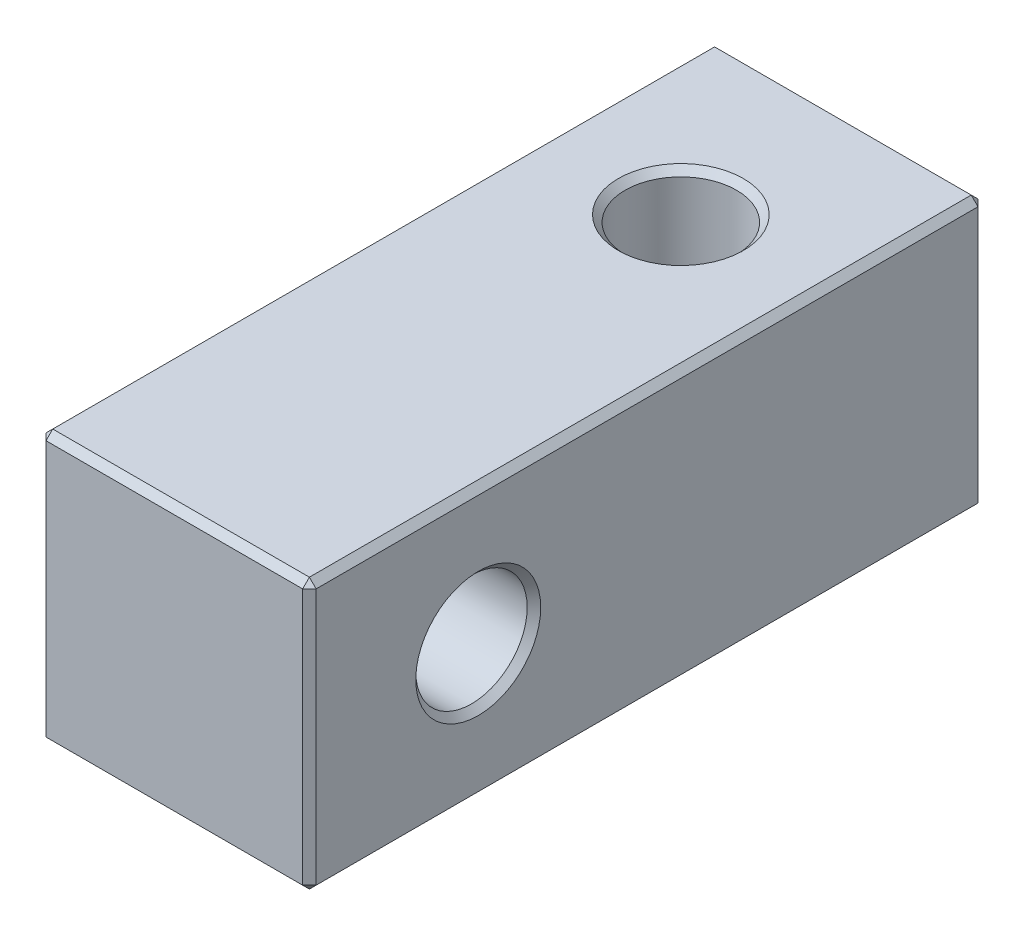
ISO-10303-21;
HEADER;
FILE_DESCRIPTION(('STEP AP214'),'2;1');
FILE_NAME('part.step','',(''),(''),'','','');
FILE_SCHEMA(('AUTOMOTIVE_DESIGN { 1 0 10303 214 1 1 1 1 }'));
ENDSEC;
DATA;
#1=APPLICATION_CONTEXT('core data for automotive mechanical design processes');
#2=APPLICATION_PROTOCOL_DEFINITION('international standard','automotive_design',2000,#1);
#3=PRODUCT_CONTEXT('',#1,'mechanical');
#4=PRODUCT('Part','Part','',(#3));
#5=PRODUCT_RELATED_PRODUCT_CATEGORY('part','',(#4));
#6=PRODUCT_DEFINITION_FORMATION('','',#4);
#7=PRODUCT_DEFINITION_CONTEXT('part definition',#1,'design');
#8=PRODUCT_DEFINITION('design','',#6,#7);
#9=PRODUCT_DEFINITION_SHAPE('','',#8);
#10=(LENGTH_UNIT() NAMED_UNIT(*) SI_UNIT(.MILLI.,.METRE.));
#11=(NAMED_UNIT(*) PLANE_ANGLE_UNIT() SI_UNIT($,.RADIAN.));
#12=(NAMED_UNIT(*) SI_UNIT($,.STERADIAN.) SOLID_ANGLE_UNIT());
#13=UNCERTAINTY_MEASURE_WITH_UNIT(LENGTH_MEASURE(1.E-05),#10,'distance_accuracy_value','');
#14=(GEOMETRIC_REPRESENTATION_CONTEXT(3) GLOBAL_UNCERTAINTY_ASSIGNED_CONTEXT((#13)) GLOBAL_UNIT_ASSIGNED_CONTEXT((#10,
#11,#12)) REPRESENTATION_CONTEXT('',''));
#15=CARTESIAN_POINT('',(0.,0.,0.));
#16=DIRECTION('',(0.,0.,1.));
#17=DIRECTION('',(1.,0.,0.));
#18=AXIS2_PLACEMENT_3D('',#15,#16,#17);
#19=CARTESIAN_POINT('',(4.,4.,10.));
#20=DIRECTION('',(-1.,0.,0.));
#21=DIRECTION('',(0.,-1.,0.));
#22=AXIS2_PLACEMENT_3D('',#19,#20,#21);
#23=PLANE('',#22);
#24=DIRECTION('',(0.,-1.,0.));
#25=VECTOR('',#24,1.);
#26=CARTESIAN_POINT('',(4.,-4.,9.8));
#27=LINE('',#26,#25);
#28=CARTESIAN_POINT('',(4.,3.8,9.8));
#29=VERTEX_POINT('',#28);
#30=CARTESIAN_POINT('',(4.,-3.8,9.8));
#31=VERTEX_POINT('',#30);
#32=EDGE_CURVE('E51',#29,#31,#27,.T.);
#33=ORIENTED_EDGE('',*,*,#32,.T.);
#34=DIRECTION('',(0.,0.,-1.));
#35=VECTOR('',#34,1.);
#36=CARTESIAN_POINT('',(4.,-3.8,10.));
#37=LINE('',#36,#35);
#38=CARTESIAN_POINT('',(4.,-3.8,-9.8));
#39=VERTEX_POINT('',#38);
#40=EDGE_CURVE('E11',#31,#39,#37,.T.);
#41=ORIENTED_EDGE('',*,*,#40,.T.);
#42=DIRECTION('',(0.,1.,0.));
#43=VECTOR('',#42,1.);
#44=CARTESIAN_POINT('',(4.,4.,-9.8));
#45=LINE('',#44,#43);
#46=CARTESIAN_POINT('',(4.,3.8,-9.8));
#47=VERTEX_POINT('',#46);
#48=EDGE_CURVE('E232',#39,#47,#45,.T.);
#49=ORIENTED_EDGE('',*,*,#48,.T.);
#50=DIRECTION('',(0.,0.,1.));
#51=VECTOR('',#50,1.);
#52=CARTESIAN_POINT('',(4.,3.8,10.));
#53=LINE('',#52,#51);
#54=EDGE_CURVE('E62',#47,#29,#53,.T.);
#55=ORIENTED_EDGE('',*,*,#54,.T.);
#56=EDGE_LOOP('',(#33,#41,#49,#55));
#57=FACE_BOUND('',#56,.T.);
#58=CARTESIAN_POINT('',(4.,0.,5.));
#59=DIRECTION('',(-1.,0.,0.));
#60=DIRECTION('',(0.,-1.,0.));
#61=AXIS2_PLACEMENT_3D('',#58,#59,#60);
#62=CIRCLE('',#61,1.85);
#63=CARTESIAN_POINT('',(4.,-1.85,5.));
#64=VERTEX_POINT('',#63);
#65=EDGE_CURVE('E229',#64,#64,#62,.T.);
#66=ORIENTED_EDGE('',*,*,#65,.T.);
#67=EDGE_LOOP('',(#66));
#68=FACE_BOUND('',#67,.T.);
#69=ADVANCED_FACE('F41',(#57,#68),#23,.F.);
#70=CARTESIAN_POINT('',(-4.,4.,10.));
#71=DIRECTION('',(0.,-1.,0.));
#72=DIRECTION('',(0.,0.,-1.));
#73=AXIS2_PLACEMENT_3D('',#70,#71,#72);
#74=PLANE('',#73);
#75=CARTESIAN_POINT('',(0.,4.,-5.));
#76=DIRECTION('',(0.,-1.,0.));
#77=DIRECTION('',(0.,0.,-1.));
#78=AXIS2_PLACEMENT_3D('',#75,#76,#77);
#79=CIRCLE('',#78,1.85);
#80=CARTESIAN_POINT('',(0.,4.,-6.85));
#81=VERTEX_POINT('',#80);
#82=EDGE_CURVE('E210',#81,#81,#79,.T.);
#83=ORIENTED_EDGE('',*,*,#82,.T.);
#84=EDGE_LOOP('',(#83));
#85=FACE_BOUND('',#84,.T.);
#86=DIRECTION('',(0.,0.,1.));
#87=VECTOR('',#86,1.);
#88=CARTESIAN_POINT('',(-3.8,4.,10.));
#89=LINE('',#88,#87);
#90=CARTESIAN_POINT('',(-3.8,4.,-9.8));
#91=VERTEX_POINT('',#90);
#92=CARTESIAN_POINT('',(-3.8,4.,9.8));
#93=VERTEX_POINT('',#92);
#94=EDGE_CURVE('E205',#91,#93,#89,.T.);
#95=ORIENTED_EDGE('',*,*,#94,.T.);
#96=DIRECTION('',(1.,0.,0.));
#97=VECTOR('',#96,1.);
#98=CARTESIAN_POINT('',(4.,4.,9.8));
#99=LINE('',#98,#97);
#100=CARTESIAN_POINT('',(3.8,4.,9.8));
#101=VERTEX_POINT('',#100);
#102=EDGE_CURVE('E207',#93,#101,#99,.T.);
#103=ORIENTED_EDGE('',*,*,#102,.T.);
#104=DIRECTION('',(0.,0.,-1.));
#105=VECTOR('',#104,1.);
#106=CARTESIAN_POINT('',(3.8,4.,10.));
#107=LINE('',#106,#105);
#108=CARTESIAN_POINT('',(3.8,4.,-9.8));
#109=VERTEX_POINT('',#108);
#110=EDGE_CURVE('E201',#101,#109,#107,.T.);
#111=ORIENTED_EDGE('',*,*,#110,.T.);
#112=DIRECTION('',(-1.,0.,0.));
#113=VECTOR('',#112,1.);
#114=CARTESIAN_POINT('',(-4.,4.,-9.8));
#115=LINE('',#114,#113);
#116=EDGE_CURVE('E203',#109,#91,#115,.T.);
#117=ORIENTED_EDGE('',*,*,#116,.T.);
#118=EDGE_LOOP('',(#95,#103,#111,#117));
#119=FACE_BOUND('',#118,.T.);
#120=ADVANCED_FACE('F332',(#85,#119),#74,.F.);
#121=CARTESIAN_POINT('',(-4.,4.,10.));
#122=DIRECTION('',(1.,0.,0.));
#123=DIRECTION('',(0.,1.,0.));
#124=AXIS2_PLACEMENT_3D('',#121,#122,#123);
#125=PLANE('',#124);
#126=CARTESIAN_POINT('',(-4.,0.,5.));
#127=DIRECTION('',(1.,0.,0.));
#128=DIRECTION('',(0.,1.,0.));
#129=AXIS2_PLACEMENT_3D('',#126,#127,#128);
#130=CIRCLE('',#129,1.84999999999999);
#131=CARTESIAN_POINT('',(-4.,1.85,5.));
#132=VERTEX_POINT('',#131);
#133=EDGE_CURVE('E192',#132,#132,#130,.T.);
#134=ORIENTED_EDGE('',*,*,#133,.T.);
#135=EDGE_LOOP('',(#134));
#136=FACE_BOUND('',#135,.T.);
#137=DIRECTION('',(0.,0.,1.));
#138=VECTOR('',#137,1.);
#139=CARTESIAN_POINT('',(-4.,-3.8,10.));
#140=LINE('',#139,#138);
#141=CARTESIAN_POINT('',(-4.,-3.8,-9.8));
#142=VERTEX_POINT('',#141);
#143=CARTESIAN_POINT('',(-4.,-3.8,9.8));
#144=VERTEX_POINT('',#143);
#145=EDGE_CURVE('E187',#142,#144,#140,.T.);
#146=ORIENTED_EDGE('',*,*,#145,.T.);
#147=DIRECTION('',(0.,1.,0.));
#148=VECTOR('',#147,1.);
#149=CARTESIAN_POINT('',(-4.,4.,9.8));
#150=LINE('',#149,#148);
#151=CARTESIAN_POINT('',(-4.,3.8,9.8));
#152=VERTEX_POINT('',#151);
#153=EDGE_CURVE('E189',#144,#152,#150,.T.);
#154=ORIENTED_EDGE('',*,*,#153,.T.);
#155=DIRECTION('',(0.,0.,-1.));
#156=VECTOR('',#155,1.);
#157=CARTESIAN_POINT('',(-4.,3.8,10.));
#158=LINE('',#157,#156);
#159=CARTESIAN_POINT('',(-4.,3.8,-9.8));
#160=VERTEX_POINT('',#159);
#161=EDGE_CURVE('E183',#152,#160,#158,.T.);
#162=ORIENTED_EDGE('',*,*,#161,.T.);
#163=DIRECTION('',(0.,-1.,0.));
#164=VECTOR('',#163,1.);
#165=CARTESIAN_POINT('',(-4.,4.,-9.8));
#166=LINE('',#165,#164);
#167=EDGE_CURVE('E185',#160,#142,#166,.T.);
#168=ORIENTED_EDGE('',*,*,#167,.T.);
#169=EDGE_LOOP('',(#146,#154,#162,#168));
#170=FACE_BOUND('',#169,.T.);
#171=ADVANCED_FACE('F360',(#136,#170),#125,.F.);
#172=CARTESIAN_POINT('',(-4.,-4.,10.));
#173=DIRECTION('',(0.,1.,0.));
#174=DIRECTION('',(0.,0.,1.));
#175=AXIS2_PLACEMENT_3D('',#172,#173,#174);
#176=PLANE('',#175);
#177=CARTESIAN_POINT('',(0.,-4.,-5.));
#178=DIRECTION('',(0.,1.,0.));
#179=DIRECTION('',(0.,0.,1.));
#180=AXIS2_PLACEMENT_3D('',#177,#178,#179);
#181=CIRCLE('',#180,1.84999999999999);
#182=CARTESIAN_POINT('',(0.,-4.,-3.15));
#183=VERTEX_POINT('',#182);
#184=EDGE_CURVE('E174',#183,#183,#181,.T.);
#185=ORIENTED_EDGE('',*,*,#184,.T.);
#186=EDGE_LOOP('',(#185));
#187=FACE_BOUND('',#186,.T.);
#188=DIRECTION('',(-1.,0.,0.));
#189=VECTOR('',#188,1.);
#190=CARTESIAN_POINT('',(-4.,-4.,9.8));
#191=LINE('',#190,#189);
#192=CARTESIAN_POINT('',(3.8,-4.,9.8));
#193=VERTEX_POINT('',#192);
#194=CARTESIAN_POINT('',(-3.8,-4.,9.8));
#195=VERTEX_POINT('',#194);
#196=EDGE_CURVE('E142',#193,#195,#191,.T.);
#197=ORIENTED_EDGE('',*,*,#196,.T.);
#198=DIRECTION('',(0.,0.,-1.));
#199=VECTOR('',#198,1.);
#200=CARTESIAN_POINT('',(-3.8,-4.,10.));
#201=LINE('',#200,#199);
#202=CARTESIAN_POINT('',(-3.8,-4.,-9.8));
#203=VERTEX_POINT('',#202);
#204=EDGE_CURVE('E138',#195,#203,#201,.T.);
#205=ORIENTED_EDGE('',*,*,#204,.T.);
#206=DIRECTION('',(1.,0.,0.));
#207=VECTOR('',#206,1.);
#208=CARTESIAN_POINT('',(-4.,-4.,-9.8));
#209=LINE('',#208,#207);
#210=CARTESIAN_POINT('',(3.8,-4.,-9.8));
#211=VERTEX_POINT('',#210);
#212=EDGE_CURVE('E130',#203,#211,#209,.T.);
#213=ORIENTED_EDGE('',*,*,#212,.T.);
#214=DIRECTION('',(0.,0.,1.));
#215=VECTOR('',#214,1.);
#216=CARTESIAN_POINT('',(3.8,-4.,10.));
#217=LINE('',#216,#215);
#218=EDGE_CURVE('E135',#211,#193,#217,.T.);
#219=ORIENTED_EDGE('',*,*,#218,.T.);
#220=EDGE_LOOP('',(#197,#205,#213,#219));
#221=FACE_BOUND('',#220,.T.);
#222=ADVANCED_FACE('F133',(#187,#221),#176,.F.);
#223=CARTESIAN_POINT('',(0.,0.,10.));
#224=DIRECTION('',(0.,0.,1.));
#225=DIRECTION('',(1.,0.,0.));
#226=AXIS2_PLACEMENT_3D('',#223,#224,#225);
#227=PLANE('',#226);
#228=DIRECTION('',(0.,-1.,0.));
#229=VECTOR('',#228,1.);
#230=CARTESIAN_POINT('',(-3.8,-4.,10.));
#231=LINE('',#230,#229);
#232=CARTESIAN_POINT('',(-3.8,3.8,10.));
#233=VERTEX_POINT('',#232);
#234=CARTESIAN_POINT('',(-3.8,-3.8,10.));
#235=VERTEX_POINT('',#234);
#236=EDGE_CURVE('E217',#233,#235,#231,.T.);
#237=ORIENTED_EDGE('',*,*,#236,.T.);
#238=DIRECTION('',(1.,0.,0.));
#239=VECTOR('',#238,1.);
#240=CARTESIAN_POINT('',(4.,-3.8,10.));
#241=LINE('',#240,#239);
#242=CARTESIAN_POINT('',(3.8,-3.8,10.));
#243=VERTEX_POINT('',#242);
#244=EDGE_CURVE('E219',#235,#243,#241,.T.);
#245=ORIENTED_EDGE('',*,*,#244,.T.);
#246=DIRECTION('',(0.,1.,0.));
#247=VECTOR('',#246,1.);
#248=CARTESIAN_POINT('',(3.8,4.,10.));
#249=LINE('',#248,#247);
#250=CARTESIAN_POINT('',(3.8,3.8,10.));
#251=VERTEX_POINT('',#250);
#252=EDGE_CURVE('E213',#243,#251,#249,.T.);
#253=ORIENTED_EDGE('',*,*,#252,.T.);
#254=DIRECTION('',(-1.,0.,0.));
#255=VECTOR('',#254,1.);
#256=CARTESIAN_POINT('',(-4.,3.8,10.));
#257=LINE('',#256,#255);
#258=EDGE_CURVE('E215',#251,#233,#257,.T.);
#259=ORIENTED_EDGE('',*,*,#258,.T.);
#260=EDGE_LOOP('',(#237,#245,#253,#259));
#261=FACE_BOUND('',#260,.T.);
#262=ADVANCED_FACE('F352',(#261),#227,.T.);
#263=CARTESIAN_POINT('',(0.,0.,-10.));
#264=DIRECTION('',(0.,0.,1.));
#265=DIRECTION('',(1.,0.,0.));
#266=AXIS2_PLACEMENT_3D('',#263,#264,#265);
#267=PLANE('',#266);
#268=DIRECTION('',(0.,-1.,0.));
#269=VECTOR('',#268,1.);
#270=CARTESIAN_POINT('',(3.8,0.,-10.));
#271=LINE('',#270,#269);
#272=CARTESIAN_POINT('',(3.8,3.8,-10.));
#273=VERTEX_POINT('',#272);
#274=CARTESIAN_POINT('',(3.8,-3.8,-10.));
#275=VERTEX_POINT('',#274);
#276=EDGE_CURVE('E222',#273,#275,#271,.T.);
#277=ORIENTED_EDGE('',*,*,#276,.T.);
#278=DIRECTION('',(-1.,0.,0.));
#279=VECTOR('',#278,1.);
#280=CARTESIAN_POINT('',(0.,-3.8,-10.));
#281=LINE('',#280,#279);
#282=CARTESIAN_POINT('',(-3.8,-3.8,-10.));
#283=VERTEX_POINT('',#282);
#284=EDGE_CURVE('E150',#275,#283,#281,.T.);
#285=ORIENTED_EDGE('',*,*,#284,.T.);
#286=DIRECTION('',(0.,1.,0.));
#287=VECTOR('',#286,1.);
#288=CARTESIAN_POINT('',(-3.8,0.,-10.));
#289=LINE('',#288,#287);
#290=CARTESIAN_POINT('',(-3.8,3.8,-10.));
#291=VERTEX_POINT('',#290);
#292=EDGE_CURVE('E226',#283,#291,#289,.T.);
#293=ORIENTED_EDGE('',*,*,#292,.T.);
#294=DIRECTION('',(1.,0.,0.));
#295=VECTOR('',#294,1.);
#296=CARTESIAN_POINT('',(0.,3.8,-10.));
#297=LINE('',#296,#295);
#298=EDGE_CURVE('E224',#291,#273,#297,.T.);
#299=ORIENTED_EDGE('',*,*,#298,.T.);
#300=EDGE_LOOP('',(#277,#285,#293,#299));
#301=FACE_BOUND('',#300,.T.);
#302=ADVANCED_FACE('F327',(#301),#267,.F.);
#303=CARTESIAN_POINT('',(4.,0.,5.));
#304=DIRECTION('',(1.,0.,0.));
#305=DIRECTION('',(0.,0.,-1.));
#306=AXIS2_PLACEMENT_3D('',#303,#304,#305);
#307=CYLINDRICAL_SURFACE('',#306,1.65);
#308=CARTESIAN_POINT('',(-3.8,0.,5.));
#309=DIRECTION('',(1.,0.,0.));
#310=DIRECTION('',(0.,0.,-1.));
#311=AXIS2_PLACEMENT_3D('',#308,#309,#310);
#312=CIRCLE('',#311,1.65);
#313=CARTESIAN_POINT('',(-3.8,0.,3.35));
#314=VERTEX_POINT('',#313);
#315=EDGE_CURVE('E198',#314,#314,#312,.F.);
#316=ORIENTED_EDGE('',*,*,#315,.T.);
#317=EDGE_LOOP('',(#316));
#318=FACE_BOUND('',#317,.T.);
#319=CARTESIAN_POINT('',(3.8,0.,5.));
#320=DIRECTION('',(-1.,0.,0.));
#321=DIRECTION('',(0.,0.,1.));
#322=AXIS2_PLACEMENT_3D('',#319,#320,#321);
#323=CIRCLE('',#322,1.65);
#324=CARTESIAN_POINT('',(3.8,0.,6.65));
#325=VERTEX_POINT('',#324);
#326=EDGE_CURVE('E195',#325,#325,#323,.F.);
#327=ORIENTED_EDGE('',*,*,#326,.T.);
#328=EDGE_LOOP('',(#327));
#329=FACE_BOUND('',#328,.T.);
#330=ADVANCED_FACE('F340',(#318,#329),#307,.F.);
#331=CARTESIAN_POINT('',(0.,4.,-5.));
#332=DIRECTION('',(0.,1.,0.));
#333=DIRECTION('',(0.,0.,1.));
#334=AXIS2_PLACEMENT_3D('',#331,#332,#333);
#335=CYLINDRICAL_SURFACE('',#334,1.65);
#336=CARTESIAN_POINT('',(0.,-3.8,-5.));
#337=DIRECTION('',(0.,1.,0.));
#338=DIRECTION('',(0.,0.,1.));
#339=AXIS2_PLACEMENT_3D('',#336,#337,#338);
#340=CIRCLE('',#339,1.65);
#341=CARTESIAN_POINT('',(0.,-3.8,-3.35));
#342=VERTEX_POINT('',#341);
#343=EDGE_CURVE('E180',#342,#342,#340,.F.);
#344=ORIENTED_EDGE('',*,*,#343,.T.);
#345=EDGE_LOOP('',(#344));
#346=FACE_BOUND('',#345,.T.);
#347=CARTESIAN_POINT('',(0.,3.8,-5.));
#348=DIRECTION('',(0.,-1.,0.));
#349=DIRECTION('',(0.,0.,-1.));
#350=AXIS2_PLACEMENT_3D('',#347,#348,#349);
#351=CIRCLE('',#350,1.65);
#352=CARTESIAN_POINT('',(0.,3.8,-6.65));
#353=VERTEX_POINT('',#352);
#354=EDGE_CURVE('E177',#353,#353,#351,.F.);
#355=ORIENTED_EDGE('',*,*,#354,.T.);
#356=EDGE_LOOP('',(#355));
#357=FACE_BOUND('',#356,.T.);
#358=ADVANCED_FACE('F342',(#346,#357),#335,.F.);
#359=CARTESIAN_POINT('',(0.,-4.,-5.));
#360=DIRECTION('',(0.,-1.,0.));
#361=DIRECTION('',(0.,0.,-1.));
#362=AXIS2_PLACEMENT_3D('',#359,#360,#361);
#363=CONICAL_SURFACE('',#362,1.85,0.785398163397447);
#364=ORIENTED_EDGE('',*,*,#343,.F.);
#365=EDGE_LOOP('',(#364));
#366=FACE_BOUND('',#365,.T.);
#367=ORIENTED_EDGE('',*,*,#184,.F.);
#368=EDGE_LOOP('',(#367));
#369=FACE_BOUND('',#368,.T.);
#370=ADVANCED_FACE('F349',(#366,#369),#363,.F.);
#371=CARTESIAN_POINT('',(-4.,0.,5.));
#372=DIRECTION('',(-1.,0.,0.));
#373=DIRECTION('',(0.,0.,1.));
#374=AXIS2_PLACEMENT_3D('',#371,#372,#373);
#375=CONICAL_SURFACE('',#374,1.84999999999999,0.785398163397439);
#376=ORIENTED_EDGE('',*,*,#315,.F.);
#377=EDGE_LOOP('',(#376));
#378=FACE_BOUND('',#377,.T.);
#379=ORIENTED_EDGE('',*,*,#133,.F.);
#380=EDGE_LOOP('',(#379));
#381=FACE_BOUND('',#380,.T.);
#382=ADVANCED_FACE('F374',(#378,#381),#375,.F.);
#383=CARTESIAN_POINT('',(0.,3.8,-5.));
#384=DIRECTION('',(0.,1.,0.));
#385=DIRECTION('',(0.,0.,1.));
#386=AXIS2_PLACEMENT_3D('',#383,#384,#385);
#387=CONICAL_SURFACE('',#386,1.65,0.785398163397443);
#388=ORIENTED_EDGE('',*,*,#82,.F.);
#389=EDGE_LOOP('',(#388));
#390=FACE_BOUND('',#389,.T.);
#391=ORIENTED_EDGE('',*,*,#354,.F.);
#392=EDGE_LOOP('',(#391));
#393=FACE_BOUND('',#392,.T.);
#394=ADVANCED_FACE('F381',(#390,#393),#387,.F.);
#395=CARTESIAN_POINT('',(-4.,4.,-9.8));
#396=DIRECTION('',(0.,-0.707106781186548,0.707106781186548));
#397=DIRECTION('',(-1.,0.,0.));
#398=AXIS2_PLACEMENT_3D('',#395,#396,#397);
#399=PLANE('',#398);
#400=DIRECTION('',(0.,0.707106781186547,0.707106781186547));
#401=VECTOR('',#400,1.);
#402=CARTESIAN_POINT('',(-3.8,3.8,-10.));
#403=LINE('',#402,#401);
#404=EDGE_CURVE('E46',#91,#291,#403,.F.);
#405=ORIENTED_EDGE('',*,*,#404,.F.);
#406=ORIENTED_EDGE('',*,*,#116,.F.);
#407=DIRECTION('',(0.,-0.707106781186547,-0.707106781186547));
#408=VECTOR('',#407,1.);
#409=CARTESIAN_POINT('',(3.8,3.8,-10.));
#410=LINE('',#409,#408);
#411=EDGE_CURVE('E170',#273,#109,#410,.F.);
#412=ORIENTED_EDGE('',*,*,#411,.F.);
#413=ORIENTED_EDGE('',*,*,#298,.F.);
#414=EDGE_LOOP('',(#405,#406,#412,#413));
#415=FACE_BOUND('',#414,.T.);
#416=ADVANCED_FACE('F388',(#415),#399,.F.);
#417=CARTESIAN_POINT('',(-3.8,3.8,-10.));
#418=DIRECTION('',(-0.577350269189626,0.577350269189626,-0.577350269189626));
#419=DIRECTION('',(-0.707106781186548,0.,0.707106781186548));
#420=AXIS2_PLACEMENT_3D('',#417,#418,#419);
#421=PLANE('',#420);
#422=DIRECTION('',(-0.707106781186547,-0.707106781186547,0.));
#423=VECTOR('',#422,1.);
#424=CARTESIAN_POINT('',(-3.9,3.9,-9.8));
#425=LINE('',#424,#423);
#426=EDGE_CURVE('E277',#91,#160,#425,.T.);
#427=ORIENTED_EDGE('',*,*,#426,.F.);
#428=ORIENTED_EDGE('',*,*,#404,.T.);
#429=DIRECTION('',(0.707106781186548,0.,-0.707106781186548));
#430=VECTOR('',#429,1.);
#431=CARTESIAN_POINT('',(-3.8,3.8,-10.));
#432=LINE('',#431,#430);
#433=EDGE_CURVE('E280',#160,#291,#432,.T.);
#434=ORIENTED_EDGE('',*,*,#433,.F.);
#435=EDGE_LOOP('',(#427,#428,#434));
#436=FACE_BOUND('',#435,.T.);
#437=ADVANCED_FACE('F489',(#436),#421,.T.);
#438=CARTESIAN_POINT('',(3.8,3.8,-10.));
#439=DIRECTION('',(0.577350269189626,0.577350269189626,-0.577350269189626));
#440=DIRECTION('',(-0.707106781186548,0.,-0.707106781186548));
#441=AXIS2_PLACEMENT_3D('',#438,#439,#440);
#442=PLANE('',#441);
#443=DIRECTION('',(0.707106781186548,0.,0.707106781186548));
#444=VECTOR('',#443,1.);
#445=CARTESIAN_POINT('',(3.8,3.8,-10.));
#446=LINE('',#445,#444);
#447=EDGE_CURVE('E271',#273,#47,#446,.T.);
#448=ORIENTED_EDGE('',*,*,#447,.F.);
#449=ORIENTED_EDGE('',*,*,#411,.T.);
#450=DIRECTION('',(-0.707106781186547,0.707106781186547,0.));
#451=VECTOR('',#450,1.);
#452=CARTESIAN_POINT('',(3.9,3.9,-9.8));
#453=LINE('',#452,#451);
#454=EDGE_CURVE('E274',#47,#109,#453,.T.);
#455=ORIENTED_EDGE('',*,*,#454,.F.);
#456=EDGE_LOOP('',(#448,#449,#455));
#457=FACE_BOUND('',#456,.T.);
#458=ADVANCED_FACE('F287',(#457),#442,.T.);
#459=CARTESIAN_POINT('',(-4.,4.,-9.8));
#460=DIRECTION('',(0.707106781186548,0.,0.707106781186548));
#461=DIRECTION('',(0.,-1.,0.));
#462=AXIS2_PLACEMENT_3D('',#459,#460,#461);
#463=PLANE('',#462);
#464=ORIENTED_EDGE('',*,*,#433,.T.);
#465=ORIENTED_EDGE('',*,*,#292,.F.);
#466=DIRECTION('',(-0.707106781186547,0.,0.707106781186547));
#467=VECTOR('',#466,1.);
#468=CARTESIAN_POINT('',(-3.8,-3.8,-10.));
#469=LINE('',#468,#467);
#470=EDGE_CURVE('E267',#142,#283,#469,.F.);
#471=ORIENTED_EDGE('',*,*,#470,.F.);
#472=ORIENTED_EDGE('',*,*,#167,.F.);
#473=EDGE_LOOP('',(#464,#465,#471,#472));
#474=FACE_BOUND('',#473,.T.);
#475=ADVANCED_FACE('F323',(#474),#463,.F.);
#476=CARTESIAN_POINT('',(-4.,3.8,10.));
#477=DIRECTION('',(0.707106781186548,-0.707106781186548,0.));
#478=DIRECTION('',(0.,0.,-1.));
#479=AXIS2_PLACEMENT_3D('',#476,#477,#478);
#480=PLANE('',#479);
#481=ORIENTED_EDGE('',*,*,#426,.T.);
#482=ORIENTED_EDGE('',*,*,#161,.F.);
#483=DIRECTION('',(0.707106781186547,0.707106781186547,0.));
#484=VECTOR('',#483,1.);
#485=CARTESIAN_POINT('',(-4.,3.8,9.8));
#486=LINE('',#485,#484);
#487=EDGE_CURVE('E264',#93,#152,#486,.F.);
#488=ORIENTED_EDGE('',*,*,#487,.F.);
#489=ORIENTED_EDGE('',*,*,#94,.F.);
#490=EDGE_LOOP('',(#481,#482,#488,#489));
#491=FACE_BOUND('',#490,.T.);
#492=ADVANCED_FACE('F471',(#491),#480,.F.);
#493=CARTESIAN_POINT('',(0.,3.8,10.));
#494=DIRECTION('',(0.,0.707106781186548,0.707106781186548));
#495=DIRECTION('',(1.,0.,0.));
#496=AXIS2_PLACEMENT_3D('',#493,#494,#495);
#497=PLANE('',#496);
#498=DIRECTION('',(0.,-0.707106781186547,0.707106781186547));
#499=VECTOR('',#498,1.);
#500=CARTESIAN_POINT('',(3.8,4.,9.8));
#501=LINE('',#500,#499);
#502=EDGE_CURVE('E258',#101,#251,#501,.T.);
#503=ORIENTED_EDGE('',*,*,#502,.F.);
#504=ORIENTED_EDGE('',*,*,#102,.F.);
#505=DIRECTION('',(0.,0.707106781186547,-0.707106781186547));
#506=VECTOR('',#505,1.);
#507=CARTESIAN_POINT('',(-3.8,3.9,9.9));
#508=LINE('',#507,#506);
#509=EDGE_CURVE('E261',#233,#93,#508,.T.);
#510=ORIENTED_EDGE('',*,*,#509,.F.);
#511=ORIENTED_EDGE('',*,*,#258,.F.);
#512=EDGE_LOOP('',(#503,#504,#510,#511));
#513=FACE_BOUND('',#512,.T.);
#514=ADVANCED_FACE('F465',(#513),#497,.T.);
#515=CARTESIAN_POINT('',(3.8,4.,10.));
#516=DIRECTION('',(-0.707106781186548,-0.707106781186548,0.));
#517=DIRECTION('',(0.,0.,-1.));
#518=AXIS2_PLACEMENT_3D('',#515,#516,#517);
#519=PLANE('',#518);
#520=ORIENTED_EDGE('',*,*,#454,.T.);
#521=ORIENTED_EDGE('',*,*,#110,.F.);
#522=DIRECTION('',(0.707106781186547,-0.707106781186547,0.));
#523=VECTOR('',#522,1.);
#524=CARTESIAN_POINT('',(3.8,4.,9.8));
#525=LINE('',#524,#523);
#526=EDGE_CURVE('E256',#29,#101,#525,.F.);
#527=ORIENTED_EDGE('',*,*,#526,.F.);
#528=ORIENTED_EDGE('',*,*,#54,.F.);
#529=EDGE_LOOP('',(#520,#521,#527,#528));
#530=FACE_BOUND('',#529,.T.);
#531=ADVANCED_FACE('F294',(#530),#519,.F.);
#532=CARTESIAN_POINT('',(4.,4.,-9.8));
#533=DIRECTION('',(-0.707106781186548,0.,0.707106781186548));
#534=DIRECTION('',(0.,1.,0.));
#535=AXIS2_PLACEMENT_3D('',#532,#533,#534);
#536=PLANE('',#535);
#537=ORIENTED_EDGE('',*,*,#447,.T.);
#538=ORIENTED_EDGE('',*,*,#48,.F.);
#539=DIRECTION('',(-0.707106781186547,0.,-0.707106781186547));
#540=VECTOR('',#539,1.);
#541=CARTESIAN_POINT('',(3.9,-3.8,-9.9));
#542=LINE('',#541,#540);
#543=EDGE_CURVE('E154',#275,#39,#542,.F.);
#544=ORIENTED_EDGE('',*,*,#543,.F.);
#545=ORIENTED_EDGE('',*,*,#276,.F.);
#546=EDGE_LOOP('',(#537,#538,#544,#545));
#547=FACE_BOUND('',#546,.T.);
#548=ADVANCED_FACE('F329',(#547),#536,.F.);
#549=CARTESIAN_POINT('',(-4.,-4.,-9.8));
#550=DIRECTION('',(0.,0.707106781186548,0.707106781186548));
#551=DIRECTION('',(1.,0.,0.));
#552=AXIS2_PLACEMENT_3D('',#549,#550,#551);
#553=PLANE('',#552);
#554=DIRECTION('',(0.,0.707106781186547,-0.707106781186547));
#555=VECTOR('',#554,1.);
#556=CARTESIAN_POINT('',(-3.8,-3.8,-10.));
#557=LINE('',#556,#555);
#558=EDGE_CURVE('E269',#283,#203,#557,.F.);
#559=ORIENTED_EDGE('',*,*,#558,.F.);
#560=ORIENTED_EDGE('',*,*,#284,.F.);
#561=DIRECTION('',(0.,-0.707106781186547,0.707106781186547));
#562=VECTOR('',#561,1.);
#563=CARTESIAN_POINT('',(3.8,-4.,-9.8));
#564=LINE('',#563,#562);
#565=EDGE_CURVE('E146',#211,#275,#564,.F.);
#566=ORIENTED_EDGE('',*,*,#565,.F.);
#567=ORIENTED_EDGE('',*,*,#212,.F.);
#568=EDGE_LOOP('',(#559,#560,#566,#567));
#569=FACE_BOUND('',#568,.T.);
#570=ADVANCED_FACE('F148',(#569),#553,.F.);
#571=CARTESIAN_POINT('',(-3.8,-3.8,-10.));
#572=DIRECTION('',(-0.577350269189626,-0.577350269189626,-0.577350269189626));
#573=DIRECTION('',(-0.707106781186548,0.,0.707106781186548));
#574=AXIS2_PLACEMENT_3D('',#571,#572,#573);
#575=PLANE('',#574);
#576=ORIENTED_EDGE('',*,*,#470,.T.);
#577=ORIENTED_EDGE('',*,*,#558,.T.);
#578=DIRECTION('',(0.707106781186547,-0.707106781186547,0.));
#579=VECTOR('',#578,1.);
#580=CARTESIAN_POINT('',(-3.9,-3.9,-9.8));
#581=LINE('',#580,#579);
#582=EDGE_CURVE('E155',#142,#203,#581,.T.);
#583=ORIENTED_EDGE('',*,*,#582,.F.);
#584=EDGE_LOOP('',(#576,#577,#583));
#585=FACE_BOUND('',#584,.T.);
#586=ADVANCED_FACE('F319',(#585),#575,.T.);
#587=CARTESIAN_POINT('',(-4.,3.8,9.8));
#588=DIRECTION('',(-0.577350269189626,0.577350269189626,0.577350269189626));
#589=DIRECTION('',(0.707106781186548,0.,0.707106781186548));
#590=AXIS2_PLACEMENT_3D('',#587,#588,#589);
#591=PLANE('',#590);
#592=ORIENTED_EDGE('',*,*,#509,.T.);
#593=ORIENTED_EDGE('',*,*,#487,.T.);
#594=DIRECTION('',(0.707106781186548,0.,0.707106781186548));
#595=VECTOR('',#594,1.);
#596=CARTESIAN_POINT('',(-4.,3.8,9.8));
#597=LINE('',#596,#595);
#598=EDGE_CURVE('E251',#233,#152,#597,.F.);
#599=ORIENTED_EDGE('',*,*,#598,.F.);
#600=EDGE_LOOP('',(#592,#593,#599));
#601=FACE_BOUND('',#600,.T.);
#602=ADVANCED_FACE('F438',(#601),#591,.T.);
#603=CARTESIAN_POINT('',(3.8,4.,9.8));
#604=DIRECTION('',(0.577350269189626,0.577350269189626,0.577350269189626));
#605=DIRECTION('',(0.707106781186548,0.,-0.707106781186548));
#606=AXIS2_PLACEMENT_3D('',#603,#604,#605);
#607=PLANE('',#606);
#608=ORIENTED_EDGE('',*,*,#526,.T.);
#609=ORIENTED_EDGE('',*,*,#502,.T.);
#610=DIRECTION('',(0.707106781186548,0.,-0.707106781186548));
#611=VECTOR('',#610,1.);
#612=CARTESIAN_POINT('',(3.9,3.8,9.9));
#613=LINE('',#612,#611);
#614=EDGE_CURVE('E161',#29,#251,#613,.F.);
#615=ORIENTED_EDGE('',*,*,#614,.F.);
#616=EDGE_LOOP('',(#608,#609,#615));
#617=FACE_BOUND('',#616,.T.);
#618=ADVANCED_FACE('F298',(#617),#607,.T.);
#619=CARTESIAN_POINT('',(3.8,-4.,-9.8));
#620=DIRECTION('',(0.577350269189626,-0.577350269189626,-0.577350269189626));
#621=DIRECTION('',(-0.707106781186548,0.,-0.707106781186548));
#622=AXIS2_PLACEMENT_3D('',#619,#620,#621);
#623=PLANE('',#622);
#624=ORIENTED_EDGE('',*,*,#565,.T.);
#625=ORIENTED_EDGE('',*,*,#543,.T.);
#626=DIRECTION('',(0.707106781186547,0.707106781186547,0.));
#627=VECTOR('',#626,1.);
#628=CARTESIAN_POINT('',(3.8,-4.,-9.8));
#629=LINE('',#628,#627);
#630=EDGE_CURVE('E157',#211,#39,#629,.T.);
#631=ORIENTED_EDGE('',*,*,#630,.F.);
#632=EDGE_LOOP('',(#624,#625,#631));
#633=FACE_BOUND('',#632,.T.);
#634=ADVANCED_FACE('F158',(#633),#623,.T.);
#635=CARTESIAN_POINT('',(-3.8,-4.,10.));
#636=DIRECTION('',(0.707106781186548,0.707106781186548,0.));
#637=DIRECTION('',(0.,0.,-1.));
#638=AXIS2_PLACEMENT_3D('',#635,#636,#637);
#639=PLANE('',#638);
#640=ORIENTED_EDGE('',*,*,#582,.T.);
#641=ORIENTED_EDGE('',*,*,#204,.F.);
#642=DIRECTION('',(-0.707106781186547,0.707106781186547,0.));
#643=VECTOR('',#642,1.);
#644=CARTESIAN_POINT('',(-3.8,-4.,9.8));
#645=LINE('',#644,#643);
#646=EDGE_CURVE('E162',#144,#195,#645,.F.);
#647=ORIENTED_EDGE('',*,*,#646,.F.);
#648=ORIENTED_EDGE('',*,*,#145,.F.);
#649=EDGE_LOOP('',(#640,#641,#647,#648));
#650=FACE_BOUND('',#649,.T.);
#651=ADVANCED_FACE('F316',(#650),#639,.F.);
#652=CARTESIAN_POINT('',(-3.8,0.,10.));
#653=DIRECTION('',(-0.707106781186548,0.,0.707106781186548));
#654=DIRECTION('',(0.,1.,0.));
#655=AXIS2_PLACEMENT_3D('',#652,#653,#654);
#656=PLANE('',#655);
#657=ORIENTED_EDGE('',*,*,#598,.T.);
#658=ORIENTED_EDGE('',*,*,#153,.F.);
#659=DIRECTION('',(-0.707106781186547,0.,-0.707106781186547));
#660=VECTOR('',#659,1.);
#661=CARTESIAN_POINT('',(-3.9,-3.8,9.9));
#662=LINE('',#661,#660);
#663=EDGE_CURVE('E244',#235,#144,#662,.T.);
#664=ORIENTED_EDGE('',*,*,#663,.F.);
#665=ORIENTED_EDGE('',*,*,#236,.F.);
#666=EDGE_LOOP('',(#657,#658,#664,#665));
#667=FACE_BOUND('',#666,.T.);
#668=ADVANCED_FACE('F416',(#667),#656,.T.);
#669=CARTESIAN_POINT('',(3.8,0.,10.));
#670=DIRECTION('',(0.707106781186548,0.,0.707106781186548));
#671=DIRECTION('',(0.,-1.,0.));
#672=AXIS2_PLACEMENT_3D('',#669,#670,#671);
#673=PLANE('',#672);
#674=ORIENTED_EDGE('',*,*,#614,.T.);
#675=ORIENTED_EDGE('',*,*,#252,.F.);
#676=DIRECTION('',(-0.707106781186547,0.,0.707106781186547));
#677=VECTOR('',#676,1.);
#678=CARTESIAN_POINT('',(3.8,-3.8,10.));
#679=LINE('',#678,#677);
#680=EDGE_CURVE('E241',#31,#243,#679,.T.);
#681=ORIENTED_EDGE('',*,*,#680,.F.);
#682=ORIENTED_EDGE('',*,*,#32,.F.);
#683=EDGE_LOOP('',(#674,#675,#681,#682));
#684=FACE_BOUND('',#683,.T.);
#685=ADVANCED_FACE('F302',(#684),#673,.T.);
#686=CARTESIAN_POINT('',(4.,-3.8,10.));
#687=DIRECTION('',(-0.707106781186548,0.707106781186548,0.));
#688=DIRECTION('',(0.,0.,-1.));
#689=AXIS2_PLACEMENT_3D('',#686,#687,#688);
#690=PLANE('',#689);
#691=ORIENTED_EDGE('',*,*,#630,.T.);
#692=ORIENTED_EDGE('',*,*,#40,.F.);
#693=DIRECTION('',(-0.707106781186547,-0.707106781186547,0.));
#694=VECTOR('',#693,1.);
#695=CARTESIAN_POINT('',(3.9,-3.9,9.8));
#696=LINE('',#695,#694);
#697=EDGE_CURVE('E166',#193,#31,#696,.F.);
#698=ORIENTED_EDGE('',*,*,#697,.F.);
#699=ORIENTED_EDGE('',*,*,#218,.F.);
#700=EDGE_LOOP('',(#691,#692,#698,#699));
#701=FACE_BOUND('',#700,.T.);
#702=ADVANCED_FACE('F164',(#701),#690,.F.);
#703=CARTESIAN_POINT('',(-3.8,-4.,9.8));
#704=DIRECTION('',(-0.577350269189626,-0.577350269189626,0.577350269189626));
#705=DIRECTION('',(0.707106781186548,0.,0.707106781186548));
#706=AXIS2_PLACEMENT_3D('',#703,#704,#705);
#707=PLANE('',#706);
#708=ORIENTED_EDGE('',*,*,#663,.T.);
#709=ORIENTED_EDGE('',*,*,#646,.T.);
#710=DIRECTION('',(0.,0.707106781186547,0.707106781186547));
#711=VECTOR('',#710,1.);
#712=CARTESIAN_POINT('',(-3.8,-4.,9.8));
#713=LINE('',#712,#711);
#714=EDGE_CURVE('E238',#235,#195,#713,.F.);
#715=ORIENTED_EDGE('',*,*,#714,.F.);
#716=EDGE_LOOP('',(#708,#709,#715));
#717=FACE_BOUND('',#716,.T.);
#718=ADVANCED_FACE('F312',(#717),#707,.T.);
#719=CARTESIAN_POINT('',(3.8,-3.8,10.));
#720=DIRECTION('',(0.577350269189626,-0.577350269189626,0.577350269189626));
#721=DIRECTION('',(0.707106781186548,0.,-0.707106781186548));
#722=AXIS2_PLACEMENT_3D('',#719,#720,#721);
#723=PLANE('',#722);
#724=ORIENTED_EDGE('',*,*,#697,.T.);
#725=ORIENTED_EDGE('',*,*,#680,.T.);
#726=DIRECTION('',(0.,-0.707106781186547,-0.707106781186547));
#727=VECTOR('',#726,1.);
#728=CARTESIAN_POINT('',(3.8,-3.8,10.));
#729=LINE('',#728,#727);
#730=EDGE_CURVE('E236',#193,#243,#729,.F.);
#731=ORIENTED_EDGE('',*,*,#730,.F.);
#732=EDGE_LOOP('',(#724,#725,#731));
#733=FACE_BOUND('',#732,.T.);
#734=ADVANCED_FACE('F305',(#733),#723,.T.);
#735=CARTESIAN_POINT('',(0.,-3.8,10.));
#736=DIRECTION('',(0.,-0.707106781186548,0.707106781186548));
#737=DIRECTION('',(-1.,0.,0.));
#738=AXIS2_PLACEMENT_3D('',#735,#736,#737);
#739=PLANE('',#738);
#740=ORIENTED_EDGE('',*,*,#714,.T.);
#741=ORIENTED_EDGE('',*,*,#196,.F.);
#742=ORIENTED_EDGE('',*,*,#730,.T.);
#743=ORIENTED_EDGE('',*,*,#244,.F.);
#744=EDGE_LOOP('',(#740,#741,#742,#743));
#745=FACE_BOUND('',#744,.T.);
#746=ADVANCED_FACE('F308',(#745),#739,.T.);
#747=CARTESIAN_POINT('',(3.8,0.,5.));
#748=DIRECTION('',(1.,0.,0.));
#749=DIRECTION('',(0.,0.,-1.));
#750=AXIS2_PLACEMENT_3D('',#747,#748,#749);
#751=CONICAL_SURFACE('',#750,1.65,0.785398163397448);
#752=ORIENTED_EDGE('',*,*,#65,.F.);
#753=EDGE_LOOP('',(#752));
#754=FACE_BOUND('',#753,.T.);
#755=ORIENTED_EDGE('',*,*,#326,.F.);
#756=EDGE_LOOP('',(#755));
#757=FACE_BOUND('',#756,.T.);
#758=ADVANCED_FACE('F44',(#754,#757),#751,.F.);
#759=CLOSED_SHELL('',(#69,#120,#171,#222,#262,#302,#330,#358,#370,#382,#394,#416,#437,#458,#475,
#492,#514,#531,#548,#570,#586,#602,#618,#634,#651,#668,#685,#702,#718,#734,#746,#758));
#760=MANIFOLD_SOLID_BREP('B2',#759);
#761=ADVANCED_BREP_SHAPE_REPRESENTATION('',(#18,#760),#14);
#762=SHAPE_DEFINITION_REPRESENTATION(#9,#761);
ENDSEC;
END-ISO-10303-21;
